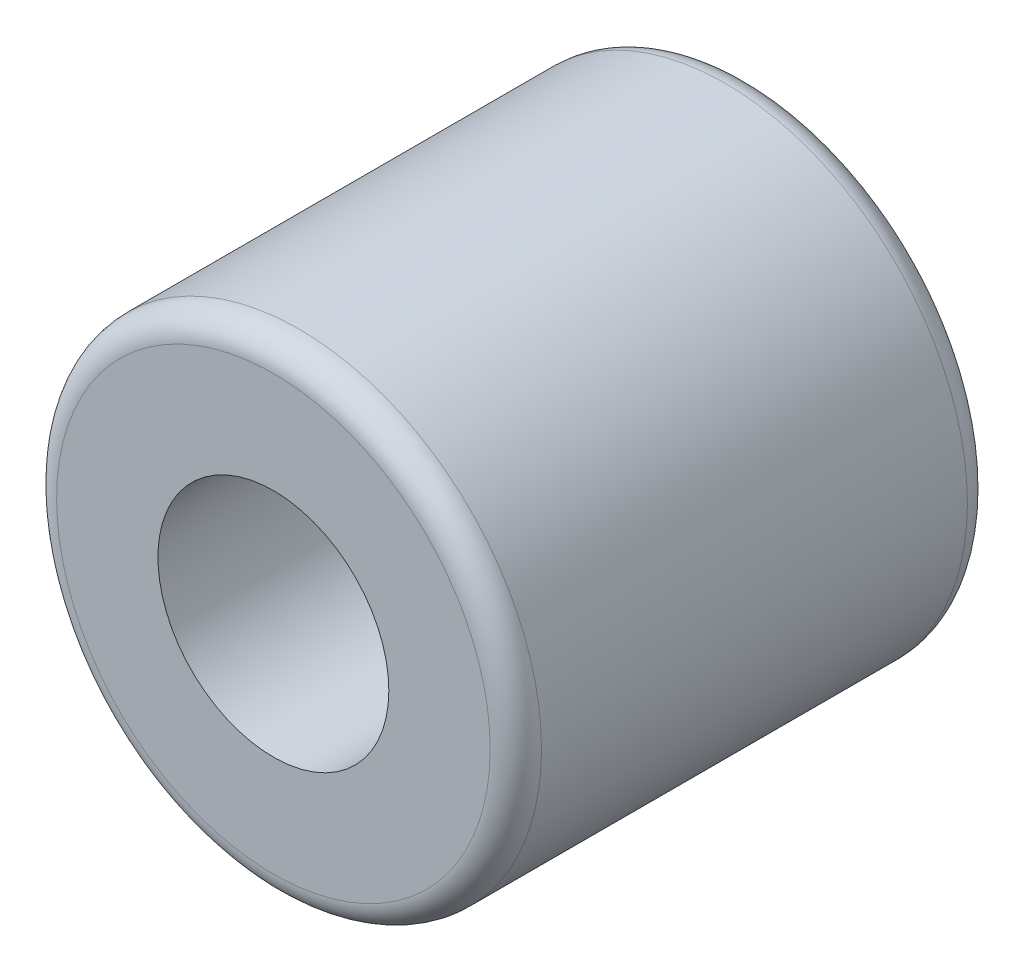
ISO-10303-21;
HEADER;
FILE_DESCRIPTION(('STEP AP214'),'2;1');
FILE_NAME('part.step','',(''),(''),'','','');
FILE_SCHEMA(('AUTOMOTIVE_DESIGN { 1 0 10303 214 1 1 1 1 }'));
ENDSEC;
DATA;
#1=APPLICATION_CONTEXT('core data for automotive mechanical design processes');
#2=APPLICATION_PROTOCOL_DEFINITION('international standard','automotive_design',2000,#1);
#3=PRODUCT_CONTEXT('',#1,'mechanical');
#4=PRODUCT('Part','Part','',(#3));
#5=PRODUCT_RELATED_PRODUCT_CATEGORY('part','',(#4));
#6=PRODUCT_DEFINITION_FORMATION('','',#4);
#7=PRODUCT_DEFINITION_CONTEXT('part definition',#1,'design');
#8=PRODUCT_DEFINITION('design','',#6,#7);
#9=PRODUCT_DEFINITION_SHAPE('','',#8);
#10=(LENGTH_UNIT() NAMED_UNIT(*) SI_UNIT(.MILLI.,.METRE.));
#11=(NAMED_UNIT(*) PLANE_ANGLE_UNIT() SI_UNIT($,.RADIAN.));
#12=(NAMED_UNIT(*) SI_UNIT($,.STERADIAN.) SOLID_ANGLE_UNIT());
#13=UNCERTAINTY_MEASURE_WITH_UNIT(LENGTH_MEASURE(1.E-05),#10,'distance_accuracy_value','');
#14=(GEOMETRIC_REPRESENTATION_CONTEXT(3) GLOBAL_UNCERTAINTY_ASSIGNED_CONTEXT((#13)) GLOBAL_UNIT_ASSIGNED_CONTEXT((#10,
#11,#12)) REPRESENTATION_CONTEXT('',''));
#15=CARTESIAN_POINT('',(0.,0.,0.));
#16=DIRECTION('',(0.,0.,1.));
#17=DIRECTION('',(1.,0.,0.));
#18=AXIS2_PLACEMENT_3D('',#15,#16,#17);
#19=CARTESIAN_POINT('',(0.,0.,18.6));
#20=DIRECTION('',(0.,0.,1.));
#21=DIRECTION('',(1.,0.,0.));
#22=AXIS2_PLACEMENT_3D('',#19,#20,#21);
#23=PLANE('',#22);
#24=CARTESIAN_POINT('',(0.,0.,18.6));
#25=DIRECTION('',(0.,0.,1.));
#26=DIRECTION('',(1.,0.,0.));
#27=AXIS2_PLACEMENT_3D('',#24,#25,#26);
#28=CIRCLE('',#27,8.45);
#29=CARTESIAN_POINT('',(8.45,0.,18.6));
#30=VERTEX_POINT('',#29);
#31=EDGE_CURVE('E10',#30,#30,#28,.T.);
#32=ORIENTED_EDGE('',*,*,#31,.T.);
#33=EDGE_LOOP('',(#32));
#34=FACE_BOUND('',#33,.T.);
#35=CARTESIAN_POINT('',(0.,0.,18.6));
#36=DIRECTION('',(0.,0.,1.));
#37=DIRECTION('',(1.,0.,0.));
#38=AXIS2_PLACEMENT_3D('',#35,#36,#37);
#39=CIRCLE('',#38,4.5);
#40=CARTESIAN_POINT('',(4.5,0.,18.6));
#41=VERTEX_POINT('',#40);
#42=EDGE_CURVE('E51',#41,#41,#39,.T.);
#43=ORIENTED_EDGE('',*,*,#42,.F.);
#44=EDGE_LOOP('',(#43));
#45=FACE_BOUND('',#44,.T.);
#46=ADVANCED_FACE('F31',(#34,#45),#23,.T.);
#47=CARTESIAN_POINT('',(0.,0.,0.));
#48=DIRECTION('',(0.,0.,1.));
#49=DIRECTION('',(1.,0.,0.));
#50=AXIS2_PLACEMENT_3D('',#47,#48,#49);
#51=PLANE('',#50);
#52=CARTESIAN_POINT('',(0.,0.,0.));
#53=DIRECTION('',(0.,0.,1.));
#54=DIRECTION('',(1.,0.,0.));
#55=AXIS2_PLACEMENT_3D('',#52,#53,#54);
#56=CIRCLE('',#55,8.45);
#57=CARTESIAN_POINT('',(8.45,0.,0.));
#58=VERTEX_POINT('',#57);
#59=EDGE_CURVE('E38',#58,#58,#56,.F.);
#60=ORIENTED_EDGE('',*,*,#59,.T.);
#61=EDGE_LOOP('',(#60));
#62=FACE_BOUND('',#61,.T.);
#63=CARTESIAN_POINT('',(0.,0.,0.));
#64=DIRECTION('',(0.,0.,1.));
#65=DIRECTION('',(1.,0.,0.));
#66=AXIS2_PLACEMENT_3D('',#63,#64,#65);
#67=CIRCLE('',#66,4.5);
#68=CARTESIAN_POINT('',(4.5,0.,0.));
#69=VERTEX_POINT('',#68);
#70=EDGE_CURVE('E52',#69,#69,#67,.T.);
#71=ORIENTED_EDGE('',*,*,#70,.T.);
#72=EDGE_LOOP('',(#71));
#73=FACE_BOUND('',#72,.T.);
#74=ADVANCED_FACE('F62',(#62,#73),#51,.F.);
#75=CARTESIAN_POINT('',(0.,0.,18.6));
#76=DIRECTION('',(0.,0.,-1.));
#77=DIRECTION('',(-1.,0.,0.));
#78=AXIS2_PLACEMENT_3D('',#75,#76,#77);
#79=CYLINDRICAL_SURFACE('',#78,9.45);
#80=CARTESIAN_POINT('',(0.,0.,1.));
#81=DIRECTION('',(0.,0.,1.));
#82=DIRECTION('',(1.,0.,0.));
#83=AXIS2_PLACEMENT_3D('',#80,#81,#82);
#84=CIRCLE('',#83,9.45);
#85=CARTESIAN_POINT('',(9.45,0.,1.));
#86=VERTEX_POINT('',#85);
#87=EDGE_CURVE('E42',#86,#86,#84,.T.);
#88=ORIENTED_EDGE('',*,*,#87,.T.);
#89=EDGE_LOOP('',(#88));
#90=FACE_BOUND('',#89,.T.);
#91=CARTESIAN_POINT('',(0.,0.,17.6));
#92=DIRECTION('',(0.,0.,1.));
#93=DIRECTION('',(1.,0.,0.));
#94=AXIS2_PLACEMENT_3D('',#91,#92,#93);
#95=CIRCLE('',#94,9.45);
#96=CARTESIAN_POINT('',(9.45,0.,17.6));
#97=VERTEX_POINT('',#96);
#98=EDGE_CURVE('E46',#97,#97,#95,.F.);
#99=ORIENTED_EDGE('',*,*,#98,.T.);
#100=EDGE_LOOP('',(#99));
#101=FACE_BOUND('',#100,.T.);
#102=ADVANCED_FACE('F67',(#90,#101),#79,.T.);
#103=CARTESIAN_POINT('',(0.,0.,18.6));
#104=DIRECTION('',(0.,0.,-1.));
#105=DIRECTION('',(-1.,0.,0.));
#106=AXIS2_PLACEMENT_3D('',#103,#104,#105);
#107=CYLINDRICAL_SURFACE('',#106,4.5);
#108=ORIENTED_EDGE('',*,*,#42,.T.);
#109=EDGE_LOOP('',(#108));
#110=FACE_BOUND('',#109,.T.);
#111=ORIENTED_EDGE('',*,*,#70,.F.);
#112=EDGE_LOOP('',(#111));
#113=FACE_BOUND('',#112,.T.);
#114=ADVANCED_FACE('F58',(#110,#113),#107,.F.);
#115=CARTESIAN_POINT('',(0.,0.,1.));
#116=DIRECTION('',(0.,0.,1.));
#117=DIRECTION('',(1.,0.,0.));
#118=AXIS2_PLACEMENT_3D('',#115,#116,#117);
#119=TOROIDAL_SURFACE('',#118,8.45,1.);
#120=ORIENTED_EDGE('',*,*,#59,.F.);
#121=EDGE_LOOP('',(#120));
#122=FACE_BOUND('',#121,.T.);
#123=ORIENTED_EDGE('',*,*,#87,.F.);
#124=EDGE_LOOP('',(#123));
#125=FACE_BOUND('',#124,.T.);
#126=ADVANCED_FACE('F73',(#122,#125),#119,.T.);
#127=CARTESIAN_POINT('',(0.,0.,17.6));
#128=DIRECTION('',(0.,0.,1.));
#129=DIRECTION('',(1.,0.,0.));
#130=AXIS2_PLACEMENT_3D('',#127,#128,#129);
#131=TOROIDAL_SURFACE('',#130,8.45,1.);
#132=ORIENTED_EDGE('',*,*,#98,.F.);
#133=EDGE_LOOP('',(#132));
#134=FACE_BOUND('',#133,.T.);
#135=ORIENTED_EDGE('',*,*,#31,.F.);
#136=EDGE_LOOP('',(#135));
#137=FACE_BOUND('',#136,.T.);
#138=ADVANCED_FACE('F33',(#134,#137),#131,.T.);
#139=CLOSED_SHELL('',(#46,#74,#102,#114,#126,#138));
#140=MANIFOLD_SOLID_BREP('B2',#139);
#141=ADVANCED_BREP_SHAPE_REPRESENTATION('',(#18,#140),#14);
#142=SHAPE_DEFINITION_REPRESENTATION(#9,#141);
ENDSEC;
END-ISO-10303-21;
